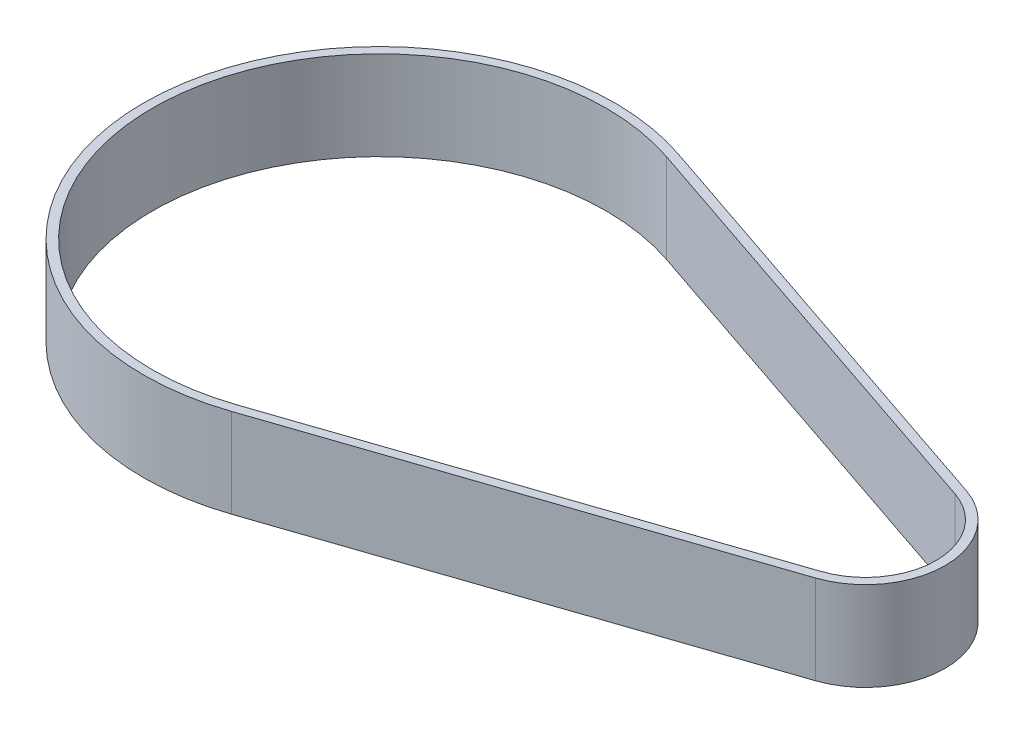
ISO-10303-21;
HEADER;
FILE_DESCRIPTION(('STEP AP214'),'2;1');
FILE_NAME('part.step','',(''),(''),'','','');
FILE_SCHEMA(('AUTOMOTIVE_DESIGN { 1 0 10303 214 1 1 1 1 }'));
ENDSEC;
DATA;
#1=APPLICATION_CONTEXT('core data for automotive mechanical design processes');
#2=APPLICATION_PROTOCOL_DEFINITION('international standard','automotive_design',2000,#1);
#3=PRODUCT_CONTEXT('',#1,'mechanical');
#4=PRODUCT('Part','Part','',(#3));
#5=PRODUCT_RELATED_PRODUCT_CATEGORY('part','',(#4));
#6=PRODUCT_DEFINITION_FORMATION('','',#4);
#7=PRODUCT_DEFINITION_CONTEXT('part definition',#1,'design');
#8=PRODUCT_DEFINITION('design','',#6,#7);
#9=PRODUCT_DEFINITION_SHAPE('','',#8);
#10=(LENGTH_UNIT() NAMED_UNIT(*) SI_UNIT(.MILLI.,.METRE.));
#11=(NAMED_UNIT(*) PLANE_ANGLE_UNIT() SI_UNIT($,.RADIAN.));
#12=(NAMED_UNIT(*) SI_UNIT($,.STERADIAN.) SOLID_ANGLE_UNIT());
#13=UNCERTAINTY_MEASURE_WITH_UNIT(LENGTH_MEASURE(1.E-05),#10,'distance_accuracy_value','');
#14=(GEOMETRIC_REPRESENTATION_CONTEXT(3) GLOBAL_UNCERTAINTY_ASSIGNED_CONTEXT((#13)) GLOBAL_UNIT_ASSIGNED_CONTEXT((#10,
#11,#12)) REPRESENTATION_CONTEXT('',''));
#15=CARTESIAN_POINT('',(0.,0.,0.));
#16=DIRECTION('',(0.,0.,1.));
#17=DIRECTION('',(1.,0.,0.));
#18=AXIS2_PLACEMENT_3D('',#15,#16,#17);
#19=CARTESIAN_POINT('',(0.,5.,0.));
#20=DIRECTION('',(0.,1.,0.));
#21=DIRECTION('',(0.,0.,1.));
#22=AXIS2_PLACEMENT_3D('',#19,#20,#21);
#23=PLANE('',#22);
#24=CARTESIAN_POINT('',(0.,5.,0.));
#25=DIRECTION('',(0.,1.,0.));
#26=DIRECTION('',(0.,0.,1.));
#27=AXIS2_PLACEMENT_3D('',#24,#25,#26);
#28=CIRCLE('',#27,8.95);
#29=CARTESIAN_POINT('',(2.87104853479853,5.,8.47700302647293));
#30=VERTEX_POINT('',#29);
#31=CARTESIAN_POINT('',(2.87104853479854,5.,-8.47700302647293));
#32=VERTEX_POINT('',#31);
#33=EDGE_CURVE('E140',#30,#32,#28,.T.);
#34=ORIENTED_EDGE('',*,*,#33,.T.);
#35=DIRECTION('',(-0.947151176142227,0.,-0.320787545787546));
#36=VECTOR('',#35,1.);
#37=CARTESIAN_POINT('',(2.87104853479854,5.,-8.47700302647293));
#38=LINE('',#37,#36);
#39=CARTESIAN_POINT('',(-46.1103576007326,5.,-25.066355876604));
#40=VERTEX_POINT('',#39);
#41=EDGE_CURVE('E143',#32,#40,#38,.T.);
#42=ORIENTED_EDGE('',*,*,#41,.T.);
#43=CARTESIAN_POINT('',(-54.6,5.,0.));
#44=DIRECTION('',(0.,1.,0.));
#45=DIRECTION('',(0.,0.,1.));
#46=AXIS2_PLACEMENT_3D('',#43,#44,#45);
#47=CIRCLE('',#46,26.465);
#48=CARTESIAN_POINT('',(-46.1103576007326,5.,25.066355876604));
#49=VERTEX_POINT('',#48);
#50=EDGE_CURVE('E146',#40,#49,#47,.T.);
#51=ORIENTED_EDGE('',*,*,#50,.T.);
#52=DIRECTION('',(0.947151176142227,0.,-0.320787545787546));
#53=VECTOR('',#52,1.);
#54=CARTESIAN_POINT('',(2.87104853479853,5.,8.47700302647293));
#55=LINE('',#54,#53);
#56=EDGE_CURVE('E148',#49,#30,#55,.T.);
#57=ORIENTED_EDGE('',*,*,#56,.T.);
#58=EDGE_LOOP('',(#34,#42,#51,#57));
#59=FACE_BOUND('',#58,.T.);
#60=DIRECTION('',(0.947151176142227,0.,-0.320787545787546));
#61=VECTOR('',#60,1.);
#62=CARTESIAN_POINT('',(2.55026098901099,5.,7.5298518503307));
#63=LINE('',#62,#61);
#64=CARTESIAN_POINT('',(-46.4311451465202,5.,24.1192047004618));
#65=VERTEX_POINT('',#64);
#66=CARTESIAN_POINT('',(2.55026098901099,5.,7.5298518503307));
#67=VERTEX_POINT('',#66);
#68=EDGE_CURVE('E112',#65,#67,#63,.T.);
#69=ORIENTED_EDGE('',*,*,#68,.F.);
#70=CARTESIAN_POINT('',(-54.6,5.,0.));
#71=DIRECTION('',(0.,1.,0.));
#72=DIRECTION('',(0.,0.,1.));
#73=AXIS2_PLACEMENT_3D('',#70,#71,#72);
#74=CIRCLE('',#73,25.465);
#75=CARTESIAN_POINT('',(-46.4311451465202,5.,-24.1192047004618));
#76=VERTEX_POINT('',#75);
#77=EDGE_CURVE('E104',#76,#65,#74,.T.);
#78=ORIENTED_EDGE('',*,*,#77,.F.);
#79=DIRECTION('',(-0.947151176142227,0.,-0.320787545787546));
#80=VECTOR('',#79,1.);
#81=CARTESIAN_POINT('',(2.55026098901099,5.,-7.5298518503307));
#82=LINE('',#81,#80);
#83=CARTESIAN_POINT('',(2.55026098901099,5.,-7.5298518503307));
#84=VERTEX_POINT('',#83);
#85=EDGE_CURVE('E126',#84,#76,#82,.T.);
#86=ORIENTED_EDGE('',*,*,#85,.F.);
#87=CARTESIAN_POINT('',(0.,5.,0.));
#88=DIRECTION('',(0.,1.,0.));
#89=DIRECTION('',(0.,0.,1.));
#90=AXIS2_PLACEMENT_3D('',#87,#88,#89);
#91=CIRCLE('',#90,7.95);
#92=EDGE_CURVE('E124',#67,#84,#91,.T.);
#93=ORIENTED_EDGE('',*,*,#92,.F.);
#94=EDGE_LOOP('',(#69,#78,#86,#93));
#95=FACE_BOUND('',#94,.T.);
#96=ADVANCED_FACE('F39',(#59,#95),#23,.T.);
#97=CARTESIAN_POINT('',(0.,-5.,0.));
#98=DIRECTION('',(0.,1.,0.));
#99=DIRECTION('',(0.,0.,1.));
#100=AXIS2_PLACEMENT_3D('',#97,#98,#99);
#101=PLANE('',#100);
#102=CARTESIAN_POINT('',(0.,-5.,0.));
#103=DIRECTION('',(0.,1.,0.));
#104=DIRECTION('',(0.,0.,1.));
#105=AXIS2_PLACEMENT_3D('',#102,#103,#104);
#106=CIRCLE('',#105,8.95);
#107=CARTESIAN_POINT('',(2.87104853479853,-5.,8.47700302647293));
#108=VERTEX_POINT('',#107);
#109=CARTESIAN_POINT('',(2.87104853479854,-5.,-8.47700302647293));
#110=VERTEX_POINT('',#109);
#111=EDGE_CURVE('E120',#108,#110,#106,.T.);
#112=ORIENTED_EDGE('',*,*,#111,.F.);
#113=DIRECTION('',(0.947151176142227,0.,-0.320787545787546));
#114=VECTOR('',#113,1.);
#115=CARTESIAN_POINT('',(2.87104853479853,-5.,8.47700302647293));
#116=LINE('',#115,#114);
#117=CARTESIAN_POINT('',(-46.1103576007326,-5.,25.066355876604));
#118=VERTEX_POINT('',#117);
#119=EDGE_CURVE('E144',#118,#108,#116,.T.);
#120=ORIENTED_EDGE('',*,*,#119,.F.);
#121=CARTESIAN_POINT('',(-54.6,-5.,0.));
#122=DIRECTION('',(0.,1.,0.));
#123=DIRECTION('',(0.,0.,1.));
#124=AXIS2_PLACEMENT_3D('',#121,#122,#123);
#125=CIRCLE('',#124,26.465);
#126=CARTESIAN_POINT('',(-46.1103576007326,-5.,-25.066355876604));
#127=VERTEX_POINT('',#126);
#128=EDGE_CURVE('E155',#127,#118,#125,.T.);
#129=ORIENTED_EDGE('',*,*,#128,.F.);
#130=DIRECTION('',(-0.947151176142227,0.,-0.320787545787546));
#131=VECTOR('',#130,1.);
#132=CARTESIAN_POINT('',(2.87104853479854,-5.,-8.47700302647293));
#133=LINE('',#132,#131);
#134=EDGE_CURVE('E153',#110,#127,#133,.T.);
#135=ORIENTED_EDGE('',*,*,#134,.F.);
#136=EDGE_LOOP('',(#112,#120,#129,#135));
#137=FACE_BOUND('',#136,.T.);
#138=CARTESIAN_POINT('',(-54.6,-5.,0.));
#139=DIRECTION('',(0.,1.,0.));
#140=DIRECTION('',(0.,0.,1.));
#141=AXIS2_PLACEMENT_3D('',#138,#139,#140);
#142=CIRCLE('',#141,25.465);
#143=CARTESIAN_POINT('',(-46.4311451465202,-5.,-24.1192047004618));
#144=VERTEX_POINT('',#143);
#145=CARTESIAN_POINT('',(-46.4311451465202,-5.,24.1192047004618));
#146=VERTEX_POINT('',#145);
#147=EDGE_CURVE('E62',#144,#146,#142,.T.);
#148=ORIENTED_EDGE('',*,*,#147,.T.);
#149=DIRECTION('',(0.947151176142227,0.,-0.320787545787546));
#150=VECTOR('',#149,1.);
#151=CARTESIAN_POINT('',(2.55026098901099,-5.,7.5298518503307));
#152=LINE('',#151,#150);
#153=CARTESIAN_POINT('',(2.55026098901099,-5.,7.5298518503307));
#154=VERTEX_POINT('',#153);
#155=EDGE_CURVE('E119',#146,#154,#152,.T.);
#156=ORIENTED_EDGE('',*,*,#155,.T.);
#157=CARTESIAN_POINT('',(0.,-5.,0.));
#158=DIRECTION('',(0.,1.,0.));
#159=DIRECTION('',(0.,0.,1.));
#160=AXIS2_PLACEMENT_3D('',#157,#158,#159);
#161=CIRCLE('',#160,7.95);
#162=CARTESIAN_POINT('',(2.55026098901099,-5.,-7.5298518503307));
#163=VERTEX_POINT('',#162);
#164=EDGE_CURVE('E132',#154,#163,#161,.T.);
#165=ORIENTED_EDGE('',*,*,#164,.T.);
#166=DIRECTION('',(-0.947151176142227,0.,-0.320787545787546));
#167=VECTOR('',#166,1.);
#168=CARTESIAN_POINT('',(2.55026098901099,-5.,-7.5298518503307));
#169=LINE('',#168,#167);
#170=EDGE_CURVE('E113',#163,#144,#169,.T.);
#171=ORIENTED_EDGE('',*,*,#170,.T.);
#172=EDGE_LOOP('',(#148,#156,#165,#171));
#173=FACE_BOUND('',#172,.T.);
#174=ADVANCED_FACE('F173',(#137,#173),#101,.F.);
#175=CARTESIAN_POINT('',(0.,5.,0.));
#176=DIRECTION('',(0.,-1.,0.));
#177=DIRECTION('',(0.,0.,-1.));
#178=AXIS2_PLACEMENT_3D('',#175,#176,#177);
#179=CYLINDRICAL_SURFACE('',#178,8.95);
#180=ORIENTED_EDGE('',*,*,#111,.T.);
#181=DIRECTION('',(0.,-1.,0.));
#182=VECTOR('',#181,1.);
#183=CARTESIAN_POINT('',(2.87104853479854,5.,-8.47700302647293));
#184=LINE('',#183,#182);
#185=EDGE_CURVE('E11',#32,#110,#184,.T.);
#186=ORIENTED_EDGE('',*,*,#185,.F.);
#187=ORIENTED_EDGE('',*,*,#33,.F.);
#188=DIRECTION('',(0.,-1.,0.));
#189=VECTOR('',#188,1.);
#190=CARTESIAN_POINT('',(2.87104853479853,5.,8.47700302647293));
#191=LINE('',#190,#189);
#192=EDGE_CURVE('E150',#30,#108,#191,.T.);
#193=ORIENTED_EDGE('',*,*,#192,.T.);
#194=EDGE_LOOP('',(#180,#186,#187,#193));
#195=FACE_BOUND('',#194,.T.);
#196=ADVANCED_FACE('F41',(#195),#179,.T.);
#197=CARTESIAN_POINT('',(2.87104853479854,5.,-8.47700302647293));
#198=DIRECTION('',(-0.320787545787546,0.,0.947151176142227));
#199=DIRECTION('',(0.947151176142227,0.,0.320787545787546));
#200=AXIS2_PLACEMENT_3D('',#197,#198,#199);
#201=PLANE('',#200);
#202=ORIENTED_EDGE('',*,*,#134,.T.);
#203=DIRECTION('',(0.,-1.,0.));
#204=VECTOR('',#203,1.);
#205=CARTESIAN_POINT('',(-46.1103576007326,5.,-25.066355876604));
#206=LINE('',#205,#204);
#207=EDGE_CURVE('E47',#40,#127,#206,.T.);
#208=ORIENTED_EDGE('',*,*,#207,.F.);
#209=ORIENTED_EDGE('',*,*,#41,.F.);
#210=ORIENTED_EDGE('',*,*,#185,.T.);
#211=EDGE_LOOP('',(#202,#208,#209,#210));
#212=FACE_BOUND('',#211,.T.);
#213=ADVANCED_FACE('F183',(#212),#201,.F.);
#214=CARTESIAN_POINT('',(-54.6,5.,0.));
#215=DIRECTION('',(0.,-1.,0.));
#216=DIRECTION('',(0.,0.,-1.));
#217=AXIS2_PLACEMENT_3D('',#214,#215,#216);
#218=CYLINDRICAL_SURFACE('',#217,26.465);
#219=ORIENTED_EDGE('',*,*,#128,.T.);
#220=DIRECTION('',(0.,-1.,0.));
#221=VECTOR('',#220,1.);
#222=CARTESIAN_POINT('',(-46.1103576007326,5.,25.066355876604));
#223=LINE('',#222,#221);
#224=EDGE_CURVE('E160',#49,#118,#223,.T.);
#225=ORIENTED_EDGE('',*,*,#224,.F.);
#226=ORIENTED_EDGE('',*,*,#50,.F.);
#227=ORIENTED_EDGE('',*,*,#207,.T.);
#228=EDGE_LOOP('',(#219,#225,#226,#227));
#229=FACE_BOUND('',#228,.T.);
#230=ADVANCED_FACE('F167',(#229),#218,.T.);
#231=CARTESIAN_POINT('',(2.87104853479853,5.,8.47700302647293));
#232=DIRECTION('',(-0.320787545787546,0.,-0.947151176142227));
#233=DIRECTION('',(-0.947151176142227,0.,0.320787545787546));
#234=AXIS2_PLACEMENT_3D('',#231,#232,#233);
#235=PLANE('',#234);
#236=ORIENTED_EDGE('',*,*,#119,.T.);
#237=ORIENTED_EDGE('',*,*,#192,.F.);
#238=ORIENTED_EDGE('',*,*,#56,.F.);
#239=ORIENTED_EDGE('',*,*,#224,.T.);
#240=EDGE_LOOP('',(#236,#237,#238,#239));
#241=FACE_BOUND('',#240,.T.);
#242=ADVANCED_FACE('F177',(#241),#235,.F.);
#243=CARTESIAN_POINT('',(-54.6,5.,0.));
#244=DIRECTION('',(0.,-1.,0.));
#245=DIRECTION('',(0.,0.,-1.));
#246=AXIS2_PLACEMENT_3D('',#243,#244,#245);
#247=CYLINDRICAL_SURFACE('',#246,25.465);
#248=ORIENTED_EDGE('',*,*,#147,.F.);
#249=DIRECTION('',(0.,-1.,0.));
#250=VECTOR('',#249,1.);
#251=CARTESIAN_POINT('',(-46.4311451465202,5.,-24.1192047004618));
#252=LINE('',#251,#250);
#253=EDGE_CURVE('E108',#76,#144,#252,.T.);
#254=ORIENTED_EDGE('',*,*,#253,.F.);
#255=ORIENTED_EDGE('',*,*,#77,.T.);
#256=DIRECTION('',(0.,-1.,0.));
#257=VECTOR('',#256,1.);
#258=CARTESIAN_POINT('',(-46.4311451465202,5.,24.1192047004618));
#259=LINE('',#258,#257);
#260=EDGE_CURVE('E107',#65,#146,#259,.T.);
#261=ORIENTED_EDGE('',*,*,#260,.T.);
#262=EDGE_LOOP('',(#248,#254,#255,#261));
#263=FACE_BOUND('',#262,.T.);
#264=ADVANCED_FACE('F106',(#263),#247,.F.);
#265=CARTESIAN_POINT('',(2.55026098901099,5.,7.5298518503307));
#266=DIRECTION('',(-0.320787545787546,0.,-0.947151176142227));
#267=DIRECTION('',(-0.947151176142227,0.,0.320787545787546));
#268=AXIS2_PLACEMENT_3D('',#265,#266,#267);
#269=PLANE('',#268);
#270=ORIENTED_EDGE('',*,*,#155,.F.);
#271=ORIENTED_EDGE('',*,*,#260,.F.);
#272=ORIENTED_EDGE('',*,*,#68,.T.);
#273=DIRECTION('',(0.,-1.,0.));
#274=VECTOR('',#273,1.);
#275=CARTESIAN_POINT('',(2.55026098901099,5.,7.5298518503307));
#276=LINE('',#275,#274);
#277=EDGE_CURVE('E121',#67,#154,#276,.T.);
#278=ORIENTED_EDGE('',*,*,#277,.T.);
#279=EDGE_LOOP('',(#270,#271,#272,#278));
#280=FACE_BOUND('',#279,.T.);
#281=ADVANCED_FACE('F116',(#280),#269,.T.);
#282=CARTESIAN_POINT('',(0.,5.,0.));
#283=DIRECTION('',(0.,-1.,0.));
#284=DIRECTION('',(0.,0.,-1.));
#285=AXIS2_PLACEMENT_3D('',#282,#283,#284);
#286=CYLINDRICAL_SURFACE('',#285,7.95);
#287=ORIENTED_EDGE('',*,*,#164,.F.);
#288=ORIENTED_EDGE('',*,*,#277,.F.);
#289=ORIENTED_EDGE('',*,*,#92,.T.);
#290=DIRECTION('',(0.,-1.,0.));
#291=VECTOR('',#290,1.);
#292=CARTESIAN_POINT('',(2.55026098901099,5.,-7.5298518503307));
#293=LINE('',#292,#291);
#294=EDGE_CURVE('E54',#84,#163,#293,.T.);
#295=ORIENTED_EDGE('',*,*,#294,.T.);
#296=EDGE_LOOP('',(#287,#288,#289,#295));
#297=FACE_BOUND('',#296,.T.);
#298=ADVANCED_FACE('F206',(#297),#286,.F.);
#299=CARTESIAN_POINT('',(2.55026098901099,5.,-7.5298518503307));
#300=DIRECTION('',(-0.320787545787546,0.,0.947151176142227));
#301=DIRECTION('',(0.947151176142227,0.,0.320787545787546));
#302=AXIS2_PLACEMENT_3D('',#299,#300,#301);
#303=PLANE('',#302);
#304=ORIENTED_EDGE('',*,*,#170,.F.);
#305=ORIENTED_EDGE('',*,*,#294,.F.);
#306=ORIENTED_EDGE('',*,*,#85,.T.);
#307=ORIENTED_EDGE('',*,*,#253,.T.);
#308=EDGE_LOOP('',(#304,#305,#306,#307));
#309=FACE_BOUND('',#308,.T.);
#310=ADVANCED_FACE('F210',(#309),#303,.T.);
#311=CLOSED_SHELL('',(#96,#174,#196,#213,#230,#242,#264,#281,#298,#310));
#312=MANIFOLD_SOLID_BREP('B2',#311);
#313=ADVANCED_BREP_SHAPE_REPRESENTATION('',(#18,#312),#14);
#314=SHAPE_DEFINITION_REPRESENTATION(#9,#313);
ENDSEC;
END-ISO-10303-21;
